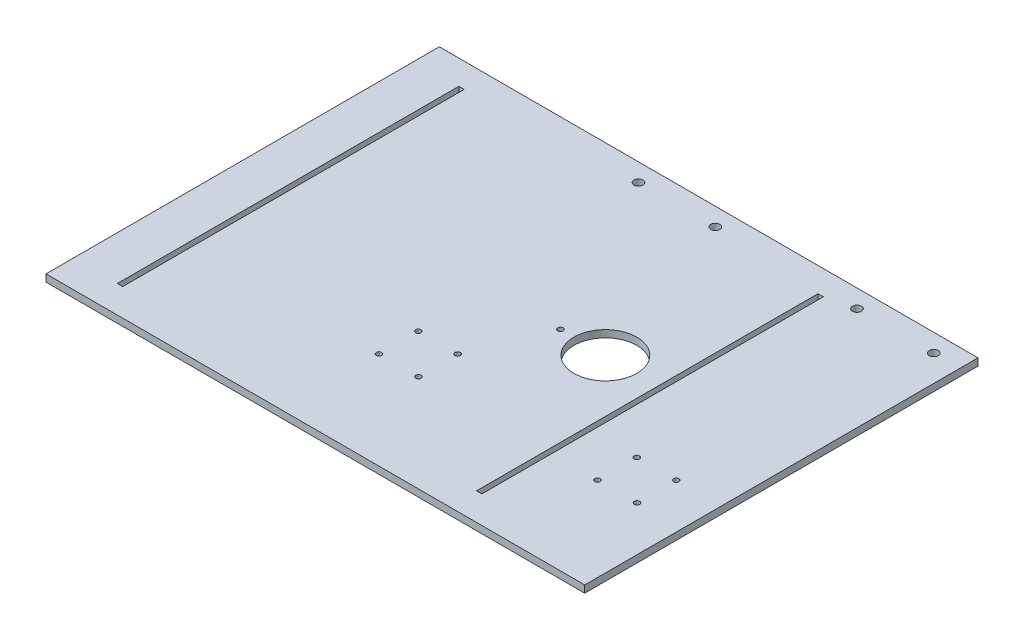
ISO-10303-21;
HEADER;
FILE_DESCRIPTION(('STEP AP214'),'2;1');
FILE_NAME('part.step','',(''),(''),'','','');
FILE_SCHEMA(('AUTOMOTIVE_DESIGN { 1 0 10303 214 1 1 1 1 }'));
ENDSEC;
DATA;
#1=APPLICATION_CONTEXT('core data for automotive mechanical design processes');
#2=APPLICATION_PROTOCOL_DEFINITION('international standard','automotive_design',2000,#1);
#3=PRODUCT_CONTEXT('',#1,'mechanical');
#4=PRODUCT('Part','Part','',(#3));
#5=PRODUCT_RELATED_PRODUCT_CATEGORY('part','',(#4));
#6=PRODUCT_DEFINITION_FORMATION('','',#4);
#7=PRODUCT_DEFINITION_CONTEXT('part definition',#1,'design');
#8=PRODUCT_DEFINITION('design','',#6,#7);
#9=PRODUCT_DEFINITION_SHAPE('','',#8);
#10=(LENGTH_UNIT() NAMED_UNIT(*) SI_UNIT(.MILLI.,.METRE.));
#11=(NAMED_UNIT(*) PLANE_ANGLE_UNIT() SI_UNIT($,.RADIAN.));
#12=(NAMED_UNIT(*) SI_UNIT($,.STERADIAN.) SOLID_ANGLE_UNIT());
#13=UNCERTAINTY_MEASURE_WITH_UNIT(LENGTH_MEASURE(1.E-05),#10,'distance_accuracy_value','');
#14=(GEOMETRIC_REPRESENTATION_CONTEXT(3) GLOBAL_UNCERTAINTY_ASSIGNED_CONTEXT((#13)) GLOBAL_UNIT_ASSIGNED_CONTEXT((#10,
#11,#12)) REPRESENTATION_CONTEXT('',''));
#15=CARTESIAN_POINT('',(0.,0.,0.));
#16=DIRECTION('',(0.,0.,1.));
#17=DIRECTION('',(1.,0.,0.));
#18=AXIS2_PLACEMENT_3D('',#15,#16,#17);
#19=CARTESIAN_POINT('',(0.,4.,0.));
#20=DIRECTION('',(0.,-1.,0.));
#21=DIRECTION('',(0.,0.,-1.));
#22=AXIS2_PLACEMENT_3D('',#19,#20,#21);
#23=PLANE('',#22);
#24=CARTESIAN_POINT('',(20.,4.,-7.00000000000002));
#25=DIRECTION('',(0.,-1.,0.));
#26=DIRECTION('',(0.,0.,-1.));
#27=AXIS2_PLACEMENT_3D('',#24,#25,#26);
#28=CIRCLE('',#27,1.5);
#29=CARTESIAN_POINT('',(20.,4.,-8.50000000000002));
#30=VERTEX_POINT('',#29);
#31=EDGE_CURVE('E269',#30,#30,#28,.T.);
#32=ORIENTED_EDGE('',*,*,#31,.T.);
#33=EDGE_LOOP('',(#32));
#34=FACE_BOUND('',#33,.T.);
#35=CARTESIAN_POINT('',(13.71,4.,-99.5));
#36=DIRECTION('',(0.,-1.,0.));
#37=DIRECTION('',(0.,0.,-1.));
#38=AXIS2_PLACEMENT_3D('',#35,#36,#37);
#39=CIRCLE('',#38,2.5);
#40=CARTESIAN_POINT('',(13.71,4.,-102.));
#41=VERTEX_POINT('',#40);
#42=EDGE_CURVE('E258',#41,#41,#39,.T.);
#43=ORIENTED_EDGE('',*,*,#42,.T.);
#44=EDGE_LOOP('',(#43));
#45=FACE_BOUND('',#44,.T.);
#46=CARTESIAN_POINT('',(-29.07,4.,-99.5));
#47=DIRECTION('',(0.,-1.,0.));
#48=DIRECTION('',(0.,0.,-1.));
#49=AXIS2_PLACEMENT_3D('',#46,#47,#48);
#50=CIRCLE('',#49,2.5);
#51=CARTESIAN_POINT('',(-29.07,4.,-102.));
#52=VERTEX_POINT('',#51);
#53=EDGE_CURVE('E264',#52,#52,#50,.T.);
#54=ORIENTED_EDGE('',*,*,#53,.T.);
#55=EDGE_LOOP('',(#54));
#56=FACE_BOUND('',#55,.T.);
#57=CARTESIAN_POINT('',(135.39,4.,-99.5));
#58=DIRECTION('',(0.,-1.,0.));
#59=DIRECTION('',(0.,0.,-1.));
#60=AXIS2_PLACEMENT_3D('',#57,#58,#59);
#61=CIRCLE('',#60,2.5);
#62=CARTESIAN_POINT('',(135.39,4.,-102.));
#63=VERTEX_POINT('',#62);
#64=EDGE_CURVE('E253',#63,#63,#61,.T.);
#65=ORIENTED_EDGE('',*,*,#64,.T.);
#66=EDGE_LOOP('',(#65));
#67=FACE_BOUND('',#66,.T.);
#68=CARTESIAN_POINT('',(92.61,4.,-99.5));
#69=DIRECTION('',(0.,-1.,0.));
#70=DIRECTION('',(0.,0.,-1.));
#71=AXIS2_PLACEMENT_3D('',#68,#69,#70);
#72=CIRCLE('',#71,2.50000000000001);
#73=CARTESIAN_POINT('',(92.61,4.,-102.));
#74=VERTEX_POINT('',#73);
#75=EDGE_CURVE('E262',#74,#74,#72,.T.);
#76=ORIENTED_EDGE('',*,*,#75,.T.);
#77=EDGE_LOOP('',(#76));
#78=FACE_BOUND('',#77,.T.);
#79=CARTESIAN_POINT('',(-18.68,4.,55.39));
#80=DIRECTION('',(0.,-1.,0.));
#81=DIRECTION('',(0.,0.,-1.));
#82=AXIS2_PLACEMENT_3D('',#79,#80,#81);
#83=CIRCLE('',#82,1.5);
#84=CARTESIAN_POINT('',(-18.68,4.,53.89));
#85=VERTEX_POINT('',#84);
#86=EDGE_CURVE('E255',#85,#85,#83,.T.);
#87=ORIENTED_EDGE('',*,*,#86,.T.);
#88=EDGE_LOOP('',(#87));
#89=FACE_BOUND('',#88,.T.);
#90=CARTESIAN_POINT('',(-18.68,4.,33.54));
#91=DIRECTION('',(0.,-1.,0.));
#92=DIRECTION('',(0.,0.,-1.));
#93=AXIS2_PLACEMENT_3D('',#90,#91,#92);
#94=CIRCLE('',#93,1.5);
#95=CARTESIAN_POINT('',(-18.68,4.,32.04));
#96=VERTEX_POINT('',#95);
#97=EDGE_CURVE('E281',#96,#96,#94,.T.);
#98=ORIENTED_EDGE('',*,*,#97,.T.);
#99=EDGE_LOOP('',(#98));
#100=FACE_BOUND('',#99,.T.);
#101=CARTESIAN_POINT('',(3.31999999999999,4.,33.54));
#102=DIRECTION('',(0.,-1.,0.));
#103=DIRECTION('',(0.,0.,-1.));
#104=AXIS2_PLACEMENT_3D('',#101,#102,#103);
#105=CIRCLE('',#104,1.5);
#106=CARTESIAN_POINT('',(3.31999999999999,4.,32.04));
#107=VERTEX_POINT('',#106);
#108=EDGE_CURVE('E278',#107,#107,#105,.T.);
#109=ORIENTED_EDGE('',*,*,#108,.T.);
#110=EDGE_LOOP('',(#109));
#111=FACE_BOUND('',#110,.T.);
#112=CARTESIAN_POINT('',(3.31999999999999,4.,55.39));
#113=DIRECTION('',(0.,-1.,0.));
#114=DIRECTION('',(0.,0.,-1.));
#115=AXIS2_PLACEMENT_3D('',#112,#113,#114);
#116=CIRCLE('',#115,1.5);
#117=CARTESIAN_POINT('',(3.31999999999999,4.,53.89));
#118=VERTEX_POINT('',#117);
#119=EDGE_CURVE('E239',#118,#118,#116,.T.);
#120=ORIENTED_EDGE('',*,*,#119,.T.);
#121=EDGE_LOOP('',(#120));
#122=FACE_BOUND('',#121,.T.);
#123=CARTESIAN_POINT('',(103.,4.,55.39));
#124=DIRECTION('',(0.,-1.,0.));
#125=DIRECTION('',(0.,0.,-1.));
#126=AXIS2_PLACEMENT_3D('',#123,#124,#125);
#127=CIRCLE('',#126,1.5);
#128=CARTESIAN_POINT('',(103.,4.,53.89));
#129=VERTEX_POINT('',#128);
#130=EDGE_CURVE('E248',#129,#129,#127,.T.);
#131=ORIENTED_EDGE('',*,*,#130,.T.);
#132=EDGE_LOOP('',(#131));
#133=FACE_BOUND('',#132,.T.);
#134=CARTESIAN_POINT('',(103.,4.,33.54));
#135=DIRECTION('',(0.,-1.,0.));
#136=DIRECTION('',(0.,0.,-1.));
#137=AXIS2_PLACEMENT_3D('',#134,#135,#136);
#138=CIRCLE('',#137,1.5);
#139=CARTESIAN_POINT('',(103.,4.,32.04));
#140=VERTEX_POINT('',#139);
#141=EDGE_CURVE('E291',#140,#140,#138,.T.);
#142=ORIENTED_EDGE('',*,*,#141,.T.);
#143=EDGE_LOOP('',(#142));
#144=FACE_BOUND('',#143,.T.);
#145=CARTESIAN_POINT('',(125.,4.,33.54));
#146=DIRECTION('',(0.,-1.,0.));
#147=DIRECTION('',(0.,0.,-1.));
#148=AXIS2_PLACEMENT_3D('',#145,#146,#147);
#149=CIRCLE('',#148,1.5);
#150=CARTESIAN_POINT('',(125.,4.,32.04));
#151=VERTEX_POINT('',#150);
#152=EDGE_CURVE('E288',#151,#151,#149,.T.);
#153=ORIENTED_EDGE('',*,*,#152,.T.);
#154=EDGE_LOOP('',(#153));
#155=FACE_BOUND('',#154,.T.);
#156=CARTESIAN_POINT('',(125.,4.,55.39));
#157=DIRECTION('',(0.,-1.,0.));
#158=DIRECTION('',(0.,0.,-1.));
#159=AXIS2_PLACEMENT_3D('',#156,#157,#158);
#160=CIRCLE('',#159,1.5);
#161=CARTESIAN_POINT('',(125.,4.,53.89));
#162=VERTEX_POINT('',#161);
#163=EDGE_CURVE('E225',#162,#162,#160,.T.);
#164=ORIENTED_EDGE('',*,*,#163,.T.);
#165=EDGE_LOOP('',(#164));
#166=FACE_BOUND('',#165,.T.);
#167=CARTESIAN_POINT('',(45.,4.,-7.00000000000002));
#168=DIRECTION('',(0.,-1.,0.));
#169=DIRECTION('',(0.,0.,-1.));
#170=AXIS2_PLACEMENT_3D('',#167,#168,#169);
#171=CIRCLE('',#170,17.5);
#172=CARTESIAN_POINT('',(45.,4.,-24.5));
#173=VERTEX_POINT('',#172);
#174=EDGE_CURVE('E155',#173,#173,#171,.T.);
#175=ORIENTED_EDGE('',*,*,#174,.T.);
#176=EDGE_LOOP('',(#175));
#177=FACE_BOUND('',#176,.T.);
#178=DIRECTION('',(-1.,0.,0.));
#179=VECTOR('',#178,1.);
#180=CARTESIAN_POINT('',(-122.5,4.,-95.8859395802149));
#181=LINE('',#180,#179);
#182=CARTESIAN_POINT('',(-122.5,4.,-95.8859395802149));
#183=VERTEX_POINT('',#182);
#184=CARTESIAN_POINT('',(-125.5,4.,-95.8859395802149));
#185=VERTEX_POINT('',#184);
#186=EDGE_CURVE('E165',#183,#185,#181,.T.);
#187=ORIENTED_EDGE('',*,*,#186,.F.);
#188=DIRECTION('',(0.,0.,-1.));
#189=VECTOR('',#188,1.);
#190=CARTESIAN_POINT('',(-122.5,4.,94.2851089201768));
#191=LINE('',#190,#189);
#192=CARTESIAN_POINT('',(-122.5,4.,94.2851089201768));
#193=VERTEX_POINT('',#192);
#194=EDGE_CURVE('E173',#193,#183,#191,.T.);
#195=ORIENTED_EDGE('',*,*,#194,.F.);
#196=DIRECTION('',(1.,0.,0.));
#197=VECTOR('',#196,1.);
#198=CARTESIAN_POINT('',(-125.5,4.,94.2851089201768));
#199=LINE('',#198,#197);
#200=CARTESIAN_POINT('',(-125.5,4.,94.2851089201768));
#201=VERTEX_POINT('',#200);
#202=EDGE_CURVE('E170',#201,#193,#199,.T.);
#203=ORIENTED_EDGE('',*,*,#202,.F.);
#204=DIRECTION('',(0.,0.,1.));
#205=VECTOR('',#204,1.);
#206=CARTESIAN_POINT('',(-125.5,4.,-95.8859395802149));
#207=LINE('',#206,#205);
#208=EDGE_CURVE('E167',#185,#201,#207,.T.);
#209=ORIENTED_EDGE('',*,*,#208,.F.);
#210=EDGE_LOOP('',(#187,#195,#203,#209));
#211=FACE_BOUND('',#210,.T.);
#212=DIRECTION('',(0.,0.,-1.));
#213=VECTOR('',#212,1.);
#214=CARTESIAN_POINT('',(150.,4.,109.5));
#215=LINE('',#214,#213);
#216=CARTESIAN_POINT('',(150.,4.,109.5));
#217=VERTEX_POINT('',#216);
#218=CARTESIAN_POINT('',(150.,4.,-109.5));
#219=VERTEX_POINT('',#218);
#220=EDGE_CURVE('E196',#217,#219,#215,.T.);
#221=ORIENTED_EDGE('',*,*,#220,.T.);
#222=DIRECTION('',(-1.,0.,0.));
#223=VECTOR('',#222,1.);
#224=CARTESIAN_POINT('',(-150.,4.,-109.5));
#225=LINE('',#224,#223);
#226=CARTESIAN_POINT('',(-150.,4.,-109.5));
#227=VERTEX_POINT('',#226);
#228=EDGE_CURVE('E199',#219,#227,#225,.T.);
#229=ORIENTED_EDGE('',*,*,#228,.T.);
#230=DIRECTION('',(0.,0.,1.));
#231=VECTOR('',#230,1.);
#232=CARTESIAN_POINT('',(-150.,4.,109.5));
#233=LINE('',#232,#231);
#234=CARTESIAN_POINT('',(-150.,4.,109.5));
#235=VERTEX_POINT('',#234);
#236=EDGE_CURVE('E202',#227,#235,#233,.T.);
#237=ORIENTED_EDGE('',*,*,#236,.T.);
#238=DIRECTION('',(1.,0.,0.));
#239=VECTOR('',#238,1.);
#240=CARTESIAN_POINT('',(-150.,4.,109.5));
#241=LINE('',#240,#239);
#242=EDGE_CURVE('E204',#235,#217,#241,.T.);
#243=ORIENTED_EDGE('',*,*,#242,.T.);
#244=EDGE_LOOP('',(#221,#229,#237,#243));
#245=FACE_BOUND('',#244,.T.);
#246=DIRECTION('',(1.,0.,0.));
#247=VECTOR('',#246,1.);
#248=CARTESIAN_POINT('',(74.5,4.,94.2851089201768));
#249=LINE('',#248,#247);
#250=CARTESIAN_POINT('',(74.5,4.,94.2851089201768));
#251=VERTEX_POINT('',#250);
#252=CARTESIAN_POINT('',(77.5,4.,94.2851089201768));
#253=VERTEX_POINT('',#252);
#254=EDGE_CURVE('E127',#251,#253,#249,.T.);
#255=ORIENTED_EDGE('',*,*,#254,.F.);
#256=DIRECTION('',(0.,0.,1.));
#257=VECTOR('',#256,1.);
#258=CARTESIAN_POINT('',(74.5,4.,-95.8859395802149));
#259=LINE('',#258,#257);
#260=CARTESIAN_POINT('',(74.5,4.,-95.8859395802149));
#261=VERTEX_POINT('',#260);
#262=EDGE_CURVE('E149',#261,#251,#259,.T.);
#263=ORIENTED_EDGE('',*,*,#262,.F.);
#264=DIRECTION('',(-1.,0.,0.));
#265=VECTOR('',#264,1.);
#266=CARTESIAN_POINT('',(77.5,4.,-95.8859395802149));
#267=LINE('',#266,#265);
#268=CARTESIAN_POINT('',(77.5,4.,-95.8859395802149));
#269=VERTEX_POINT('',#268);
#270=EDGE_CURVE('E147',#269,#261,#267,.T.);
#271=ORIENTED_EDGE('',*,*,#270,.F.);
#272=DIRECTION('',(0.,0.,-1.));
#273=VECTOR('',#272,1.);
#274=CARTESIAN_POINT('',(77.5,4.,94.2851089201768));
#275=LINE('',#274,#273);
#276=EDGE_CURVE('E135',#253,#269,#275,.T.);
#277=ORIENTED_EDGE('',*,*,#276,.F.);
#278=EDGE_LOOP('',(#255,#263,#271,#277));
#279=FACE_BOUND('',#278,.T.);
#280=ADVANCED_FACE('F36',(#34,#45,#56,#67,#78,#89,#100,#111,#122,#133,#144,#155,#166,#177,#211,
#245,#279),#23,.F.);
#281=CARTESIAN_POINT('',(0.,0.,0.));
#282=DIRECTION('',(0.,-1.,0.));
#283=DIRECTION('',(0.,0.,-1.));
#284=AXIS2_PLACEMENT_3D('',#281,#282,#283);
#285=PLANE('',#284);
#286=CARTESIAN_POINT('',(20.,0.,-7.00000000000002));
#287=DIRECTION('',(0.,1.,0.));
#288=DIRECTION('',(0.,0.,1.));
#289=AXIS2_PLACEMENT_3D('',#286,#287,#288);
#290=CIRCLE('',#289,1.5);
#291=CARTESIAN_POINT('',(20.,0.,-5.50000000000002));
#292=VERTEX_POINT('',#291);
#293=EDGE_CURVE('E659',#292,#292,#290,.T.);
#294=ORIENTED_EDGE('',*,*,#293,.T.);
#295=EDGE_LOOP('',(#294));
#296=FACE_BOUND('',#295,.T.);
#297=CARTESIAN_POINT('',(13.71,0.,-99.5));
#298=DIRECTION('',(0.,-1.,0.));
#299=DIRECTION('',(0.,0.,-1.));
#300=AXIS2_PLACEMENT_3D('',#297,#298,#299);
#301=CIRCLE('',#300,2.5);
#302=CARTESIAN_POINT('',(13.71,0.,-102.));
#303=VERTEX_POINT('',#302);
#304=EDGE_CURVE('E40',#303,#303,#301,.T.);
#305=ORIENTED_EDGE('',*,*,#304,.F.);
#306=EDGE_LOOP('',(#305));
#307=FACE_BOUND('',#306,.T.);
#308=CARTESIAN_POINT('',(-29.07,0.,-99.5));
#309=DIRECTION('',(0.,-1.,0.));
#310=DIRECTION('',(0.,0.,-1.));
#311=AXIS2_PLACEMENT_3D('',#308,#309,#310);
#312=CIRCLE('',#311,2.5);
#313=CARTESIAN_POINT('',(-29.07,0.,-102.));
#314=VERTEX_POINT('',#313);
#315=EDGE_CURVE('E256',#314,#314,#312,.T.);
#316=ORIENTED_EDGE('',*,*,#315,.F.);
#317=EDGE_LOOP('',(#316));
#318=FACE_BOUND('',#317,.T.);
#319=CARTESIAN_POINT('',(135.39,0.,-99.5));
#320=DIRECTION('',(0.,-1.,0.));
#321=DIRECTION('',(0.,0.,-1.));
#322=AXIS2_PLACEMENT_3D('',#319,#320,#321);
#323=CIRCLE('',#322,2.5);
#324=CARTESIAN_POINT('',(135.39,0.,-102.));
#325=VERTEX_POINT('',#324);
#326=EDGE_CURVE('E252',#325,#325,#323,.T.);
#327=ORIENTED_EDGE('',*,*,#326,.F.);
#328=EDGE_LOOP('',(#327));
#329=FACE_BOUND('',#328,.T.);
#330=CARTESIAN_POINT('',(92.61,0.,-99.5));
#331=DIRECTION('',(0.,-1.,0.));
#332=DIRECTION('',(0.,0.,-1.));
#333=AXIS2_PLACEMENT_3D('',#330,#331,#332);
#334=CIRCLE('',#333,2.50000000000001);
#335=CARTESIAN_POINT('',(92.61,0.,-102.));
#336=VERTEX_POINT('',#335);
#337=EDGE_CURVE('E249',#336,#336,#334,.T.);
#338=ORIENTED_EDGE('',*,*,#337,.F.);
#339=EDGE_LOOP('',(#338));
#340=FACE_BOUND('',#339,.T.);
#341=CARTESIAN_POINT('',(-18.68,0.,55.39));
#342=DIRECTION('',(0.,-1.,0.));
#343=DIRECTION('',(0.,0.,-1.));
#344=AXIS2_PLACEMENT_3D('',#341,#342,#343);
#345=CIRCLE('',#344,1.5);
#346=CARTESIAN_POINT('',(-18.68,0.,53.89));
#347=VERTEX_POINT('',#346);
#348=EDGE_CURVE('E245',#347,#347,#345,.T.);
#349=ORIENTED_EDGE('',*,*,#348,.F.);
#350=EDGE_LOOP('',(#349));
#351=FACE_BOUND('',#350,.T.);
#352=CARTESIAN_POINT('',(-18.68,0.,33.54));
#353=DIRECTION('',(0.,-1.,0.));
#354=DIRECTION('',(0.,0.,-1.));
#355=AXIS2_PLACEMENT_3D('',#352,#353,#354);
#356=CIRCLE('',#355,1.5);
#357=CARTESIAN_POINT('',(-18.68,0.,32.04));
#358=VERTEX_POINT('',#357);
#359=EDGE_CURVE('E242',#358,#358,#356,.T.);
#360=ORIENTED_EDGE('',*,*,#359,.F.);
#361=EDGE_LOOP('',(#360));
#362=FACE_BOUND('',#361,.T.);
#363=CARTESIAN_POINT('',(3.31999999999999,0.,33.54));
#364=DIRECTION('',(0.,-1.,0.));
#365=DIRECTION('',(0.,0.,-1.));
#366=AXIS2_PLACEMENT_3D('',#363,#364,#365);
#367=CIRCLE('',#366,1.5);
#368=CARTESIAN_POINT('',(3.31999999999999,0.,32.04));
#369=VERTEX_POINT('',#368);
#370=EDGE_CURVE('E238',#369,#369,#367,.T.);
#371=ORIENTED_EDGE('',*,*,#370,.F.);
#372=EDGE_LOOP('',(#371));
#373=FACE_BOUND('',#372,.T.);
#374=CARTESIAN_POINT('',(3.31999999999999,0.,55.39));
#375=DIRECTION('',(0.,-1.,0.));
#376=DIRECTION('',(0.,0.,-1.));
#377=AXIS2_PLACEMENT_3D('',#374,#375,#376);
#378=CIRCLE('',#377,1.5);
#379=CARTESIAN_POINT('',(3.31999999999999,0.,53.89));
#380=VERTEX_POINT('',#379);
#381=EDGE_CURVE('E235',#380,#380,#378,.T.);
#382=ORIENTED_EDGE('',*,*,#381,.F.);
#383=EDGE_LOOP('',(#382));
#384=FACE_BOUND('',#383,.T.);
#385=CARTESIAN_POINT('',(103.,0.,55.39));
#386=DIRECTION('',(0.,-1.,0.));
#387=DIRECTION('',(0.,0.,-1.));
#388=AXIS2_PLACEMENT_3D('',#385,#386,#387);
#389=CIRCLE('',#388,1.5);
#390=CARTESIAN_POINT('',(103.,0.,53.89));
#391=VERTEX_POINT('',#390);
#392=EDGE_CURVE('E231',#391,#391,#389,.T.);
#393=ORIENTED_EDGE('',*,*,#392,.F.);
#394=EDGE_LOOP('',(#393));
#395=FACE_BOUND('',#394,.T.);
#396=CARTESIAN_POINT('',(103.,0.,33.54));
#397=DIRECTION('',(0.,-1.,0.));
#398=DIRECTION('',(0.,0.,-1.));
#399=AXIS2_PLACEMENT_3D('',#396,#397,#398);
#400=CIRCLE('',#399,1.5);
#401=CARTESIAN_POINT('',(103.,0.,32.04));
#402=VERTEX_POINT('',#401);
#403=EDGE_CURVE('E228',#402,#402,#400,.T.);
#404=ORIENTED_EDGE('',*,*,#403,.F.);
#405=EDGE_LOOP('',(#404));
#406=FACE_BOUND('',#405,.T.);
#407=CARTESIAN_POINT('',(125.,0.,33.54));
#408=DIRECTION('',(0.,-1.,0.));
#409=DIRECTION('',(0.,0.,-1.));
#410=AXIS2_PLACEMENT_3D('',#407,#408,#409);
#411=CIRCLE('',#410,1.5);
#412=CARTESIAN_POINT('',(125.,0.,32.04));
#413=VERTEX_POINT('',#412);
#414=EDGE_CURVE('E224',#413,#413,#411,.T.);
#415=ORIENTED_EDGE('',*,*,#414,.F.);
#416=EDGE_LOOP('',(#415));
#417=FACE_BOUND('',#416,.T.);
#418=CARTESIAN_POINT('',(125.,0.,55.39));
#419=DIRECTION('',(0.,-1.,0.));
#420=DIRECTION('',(0.,0.,-1.));
#421=AXIS2_PLACEMENT_3D('',#418,#419,#420);
#422=CIRCLE('',#421,1.5);
#423=CARTESIAN_POINT('',(125.,0.,53.89));
#424=VERTEX_POINT('',#423);
#425=EDGE_CURVE('E221',#424,#424,#422,.T.);
#426=ORIENTED_EDGE('',*,*,#425,.F.);
#427=EDGE_LOOP('',(#426));
#428=FACE_BOUND('',#427,.T.);
#429=CARTESIAN_POINT('',(45.,0.,-7.00000000000002));
#430=DIRECTION('',(0.,-1.,0.));
#431=DIRECTION('',(0.,0.,-1.));
#432=AXIS2_PLACEMENT_3D('',#429,#430,#431);
#433=CIRCLE('',#432,17.5);
#434=CARTESIAN_POINT('',(45.,0.,-24.5));
#435=VERTEX_POINT('',#434);
#436=EDGE_CURVE('E234',#435,#435,#433,.T.);
#437=ORIENTED_EDGE('',*,*,#436,.F.);
#438=EDGE_LOOP('',(#437));
#439=FACE_BOUND('',#438,.T.);
#440=DIRECTION('',(0.,0.,-1.));
#441=VECTOR('',#440,1.);
#442=CARTESIAN_POINT('',(150.,0.,109.5));
#443=LINE('',#442,#441);
#444=CARTESIAN_POINT('',(150.,0.,109.5));
#445=VERTEX_POINT('',#444);
#446=CARTESIAN_POINT('',(150.,0.,-109.5));
#447=VERTEX_POINT('',#446);
#448=EDGE_CURVE('E195',#445,#447,#443,.T.);
#449=ORIENTED_EDGE('',*,*,#448,.F.);
#450=DIRECTION('',(1.,0.,0.));
#451=VECTOR('',#450,1.);
#452=CARTESIAN_POINT('',(-150.,0.,109.5));
#453=LINE('',#452,#451);
#454=CARTESIAN_POINT('',(-150.,0.,109.5));
#455=VERTEX_POINT('',#454);
#456=EDGE_CURVE('E200',#455,#445,#453,.T.);
#457=ORIENTED_EDGE('',*,*,#456,.F.);
#458=DIRECTION('',(0.,0.,1.));
#459=VECTOR('',#458,1.);
#460=CARTESIAN_POINT('',(-150.,0.,109.5));
#461=LINE('',#460,#459);
#462=CARTESIAN_POINT('',(-150.,0.,-109.5));
#463=VERTEX_POINT('',#462);
#464=EDGE_CURVE('E211',#463,#455,#461,.T.);
#465=ORIENTED_EDGE('',*,*,#464,.F.);
#466=DIRECTION('',(-1.,0.,0.));
#467=VECTOR('',#466,1.);
#468=CARTESIAN_POINT('',(-150.,0.,-109.5));
#469=LINE('',#468,#467);
#470=EDGE_CURVE('E209',#447,#463,#469,.T.);
#471=ORIENTED_EDGE('',*,*,#470,.F.);
#472=EDGE_LOOP('',(#449,#457,#465,#471));
#473=FACE_BOUND('',#472,.T.);
#474=DIRECTION('',(0.,0.,-1.));
#475=VECTOR('',#474,1.);
#476=CARTESIAN_POINT('',(-122.5,0.,94.2851089201768));
#477=LINE('',#476,#475);
#478=CARTESIAN_POINT('',(-122.5,0.,94.2851089201768));
#479=VERTEX_POINT('',#478);
#480=CARTESIAN_POINT('',(-122.5,0.,-95.8859395802149));
#481=VERTEX_POINT('',#480);
#482=EDGE_CURVE('E168',#479,#481,#477,.T.);
#483=ORIENTED_EDGE('',*,*,#482,.T.);
#484=DIRECTION('',(-1.,0.,0.));
#485=VECTOR('',#484,1.);
#486=CARTESIAN_POINT('',(-122.5,0.,-95.8859395802149));
#487=LINE('',#486,#485);
#488=CARTESIAN_POINT('',(-125.5,0.,-95.8859395802149));
#489=VERTEX_POINT('',#488);
#490=EDGE_CURVE('E143',#481,#489,#487,.T.);
#491=ORIENTED_EDGE('',*,*,#490,.T.);
#492=DIRECTION('',(0.,0.,1.));
#493=VECTOR('',#492,1.);
#494=CARTESIAN_POINT('',(-125.5,0.,-95.8859395802149));
#495=LINE('',#494,#493);
#496=CARTESIAN_POINT('',(-125.5,0.,94.2851089201768));
#497=VERTEX_POINT('',#496);
#498=EDGE_CURVE('E178',#489,#497,#495,.T.);
#499=ORIENTED_EDGE('',*,*,#498,.T.);
#500=DIRECTION('',(1.,0.,0.));
#501=VECTOR('',#500,1.);
#502=CARTESIAN_POINT('',(-125.5,0.,94.2851089201768));
#503=LINE('',#502,#501);
#504=EDGE_CURVE('E181',#497,#479,#503,.T.);
#505=ORIENTED_EDGE('',*,*,#504,.T.);
#506=EDGE_LOOP('',(#483,#491,#499,#505));
#507=FACE_BOUND('',#506,.T.);
#508=DIRECTION('',(0.,0.,1.));
#509=VECTOR('',#508,1.);
#510=CARTESIAN_POINT('',(74.5,0.,-95.8859395802149));
#511=LINE('',#510,#509);
#512=CARTESIAN_POINT('',(74.5,0.,-95.8859395802149));
#513=VERTEX_POINT('',#512);
#514=CARTESIAN_POINT('',(74.5,0.,94.2851089201768));
#515=VERTEX_POINT('',#514);
#516=EDGE_CURVE('E136',#513,#515,#511,.T.);
#517=ORIENTED_EDGE('',*,*,#516,.T.);
#518=DIRECTION('',(1.,0.,0.));
#519=VECTOR('',#518,1.);
#520=CARTESIAN_POINT('',(74.5,0.,94.2851089201768));
#521=LINE('',#520,#519);
#522=CARTESIAN_POINT('',(77.5,0.,94.2851089201768));
#523=VERTEX_POINT('',#522);
#524=EDGE_CURVE('E61',#515,#523,#521,.T.);
#525=ORIENTED_EDGE('',*,*,#524,.T.);
#526=DIRECTION('',(0.,0.,-1.));
#527=VECTOR('',#526,1.);
#528=CARTESIAN_POINT('',(77.5,0.,94.2851089201768));
#529=LINE('',#528,#527);
#530=CARTESIAN_POINT('',(77.5,0.,-95.8859395802149));
#531=VERTEX_POINT('',#530);
#532=EDGE_CURVE('E142',#523,#531,#529,.T.);
#533=ORIENTED_EDGE('',*,*,#532,.T.);
#534=DIRECTION('',(-1.,0.,0.));
#535=VECTOR('',#534,1.);
#536=CARTESIAN_POINT('',(77.5,0.,-95.8859395802149));
#537=LINE('',#536,#535);
#538=EDGE_CURVE('E157',#531,#513,#537,.T.);
#539=ORIENTED_EDGE('',*,*,#538,.T.);
#540=EDGE_LOOP('',(#517,#525,#533,#539));
#541=FACE_BOUND('',#540,.T.);
#542=ADVANCED_FACE('F304',(#296,#307,#318,#329,#340,#351,#362,#373,#384,#395,#406,#417,#428,
#439,#473,#507,#541),#285,.T.);
#543=CARTESIAN_POINT('',(150.,4.,109.5));
#544=DIRECTION('',(-1.,0.,0.));
#545=DIRECTION('',(0.,0.,1.));
#546=AXIS2_PLACEMENT_3D('',#543,#544,#545);
#547=PLANE('',#546);
#548=ORIENTED_EDGE('',*,*,#448,.T.);
#549=DIRECTION('',(0.,-1.,0.));
#550=VECTOR('',#549,1.);
#551=CARTESIAN_POINT('',(150.,4.,-109.5));
#552=LINE('',#551,#550);
#553=EDGE_CURVE('E11',#219,#447,#552,.T.);
#554=ORIENTED_EDGE('',*,*,#553,.F.);
#555=ORIENTED_EDGE('',*,*,#220,.F.);
#556=DIRECTION('',(0.,-1.,0.));
#557=VECTOR('',#556,1.);
#558=CARTESIAN_POINT('',(150.,4.,109.5));
#559=LINE('',#558,#557);
#560=EDGE_CURVE('E206',#217,#445,#559,.T.);
#561=ORIENTED_EDGE('',*,*,#560,.T.);
#562=EDGE_LOOP('',(#548,#554,#555,#561));
#563=FACE_BOUND('',#562,.T.);
#564=ADVANCED_FACE('F38',(#563),#547,.F.);
#565=CARTESIAN_POINT('',(-150.,4.,-109.5));
#566=DIRECTION('',(0.,0.,1.));
#567=DIRECTION('',(1.,0.,0.));
#568=AXIS2_PLACEMENT_3D('',#565,#566,#567);
#569=PLANE('',#568);
#570=ORIENTED_EDGE('',*,*,#470,.T.);
#571=DIRECTION('',(0.,-1.,0.));
#572=VECTOR('',#571,1.);
#573=CARTESIAN_POINT('',(-150.,4.,-109.5));
#574=LINE('',#573,#572);
#575=EDGE_CURVE('E45',#227,#463,#574,.T.);
#576=ORIENTED_EDGE('',*,*,#575,.F.);
#577=ORIENTED_EDGE('',*,*,#228,.F.);
#578=ORIENTED_EDGE('',*,*,#553,.T.);
#579=EDGE_LOOP('',(#570,#576,#577,#578));
#580=FACE_BOUND('',#579,.T.);
#581=ADVANCED_FACE('F344',(#580),#569,.F.);
#582=CARTESIAN_POINT('',(-150.,4.,109.5));
#583=DIRECTION('',(1.,0.,0.));
#584=DIRECTION('',(0.,0.,-1.));
#585=AXIS2_PLACEMENT_3D('',#582,#583,#584);
#586=PLANE('',#585);
#587=ORIENTED_EDGE('',*,*,#464,.T.);
#588=DIRECTION('',(0.,-1.,0.));
#589=VECTOR('',#588,1.);
#590=CARTESIAN_POINT('',(-150.,4.,109.5));
#591=LINE('',#590,#589);
#592=EDGE_CURVE('E216',#235,#455,#591,.T.);
#593=ORIENTED_EDGE('',*,*,#592,.F.);
#594=ORIENTED_EDGE('',*,*,#236,.F.);
#595=ORIENTED_EDGE('',*,*,#575,.T.);
#596=EDGE_LOOP('',(#587,#593,#594,#595));
#597=FACE_BOUND('',#596,.T.);
#598=ADVANCED_FACE('F341',(#597),#586,.F.);
#599=CARTESIAN_POINT('',(-150.,4.,109.5));
#600=DIRECTION('',(0.,0.,-1.));
#601=DIRECTION('',(-1.,0.,0.));
#602=AXIS2_PLACEMENT_3D('',#599,#600,#601);
#603=PLANE('',#602);
#604=ORIENTED_EDGE('',*,*,#456,.T.);
#605=ORIENTED_EDGE('',*,*,#560,.F.);
#606=ORIENTED_EDGE('',*,*,#242,.F.);
#607=ORIENTED_EDGE('',*,*,#592,.T.);
#608=EDGE_LOOP('',(#604,#605,#606,#607));
#609=FACE_BOUND('',#608,.T.);
#610=ADVANCED_FACE('F338',(#609),#603,.F.);
#611=CARTESIAN_POINT('',(-122.5,4.,-95.8859395802149));
#612=DIRECTION('',(0.,0.,1.));
#613=DIRECTION('',(1.,0.,0.));
#614=AXIS2_PLACEMENT_3D('',#611,#612,#613);
#615=PLANE('',#614);
#616=ORIENTED_EDGE('',*,*,#490,.F.);
#617=DIRECTION('',(0.,-1.,0.));
#618=VECTOR('',#617,1.);
#619=CARTESIAN_POINT('',(-122.5,4.,-95.8859395802149));
#620=LINE('',#619,#618);
#621=EDGE_CURVE('E175',#183,#481,#620,.T.);
#622=ORIENTED_EDGE('',*,*,#621,.F.);
#623=ORIENTED_EDGE('',*,*,#186,.T.);
#624=DIRECTION('',(0.,-1.,0.));
#625=VECTOR('',#624,1.);
#626=CARTESIAN_POINT('',(-125.5,4.,-95.8859395802149));
#627=LINE('',#626,#625);
#628=EDGE_CURVE('E192',#185,#489,#627,.T.);
#629=ORIENTED_EDGE('',*,*,#628,.T.);
#630=EDGE_LOOP('',(#616,#622,#623,#629));
#631=FACE_BOUND('',#630,.T.);
#632=ADVANCED_FACE('F335',(#631),#615,.T.);
#633=CARTESIAN_POINT('',(-125.5,4.,-95.8859395802149));
#634=DIRECTION('',(1.,0.,0.));
#635=DIRECTION('',(0.,0.,-1.));
#636=AXIS2_PLACEMENT_3D('',#633,#634,#635);
#637=PLANE('',#636);
#638=ORIENTED_EDGE('',*,*,#498,.F.);
#639=ORIENTED_EDGE('',*,*,#628,.F.);
#640=ORIENTED_EDGE('',*,*,#208,.T.);
#641=DIRECTION('',(0.,-1.,0.));
#642=VECTOR('',#641,1.);
#643=CARTESIAN_POINT('',(-125.5,4.,94.2851089201768));
#644=LINE('',#643,#642);
#645=EDGE_CURVE('E190',#201,#497,#644,.T.);
#646=ORIENTED_EDGE('',*,*,#645,.T.);
#647=EDGE_LOOP('',(#638,#639,#640,#646));
#648=FACE_BOUND('',#647,.T.);
#649=ADVANCED_FACE('F525',(#648),#637,.T.);
#650=CARTESIAN_POINT('',(-125.5,4.,94.2851089201768));
#651=DIRECTION('',(0.,0.,-1.));
#652=DIRECTION('',(-1.,0.,0.));
#653=AXIS2_PLACEMENT_3D('',#650,#651,#652);
#654=PLANE('',#653);
#655=ORIENTED_EDGE('',*,*,#504,.F.);
#656=ORIENTED_EDGE('',*,*,#645,.F.);
#657=ORIENTED_EDGE('',*,*,#202,.T.);
#658=DIRECTION('',(0.,-1.,0.));
#659=VECTOR('',#658,1.);
#660=CARTESIAN_POINT('',(-122.5,4.,94.2851089201768));
#661=LINE('',#660,#659);
#662=EDGE_CURVE('E188',#193,#479,#661,.T.);
#663=ORIENTED_EDGE('',*,*,#662,.T.);
#664=EDGE_LOOP('',(#655,#656,#657,#663));
#665=FACE_BOUND('',#664,.T.);
#666=ADVANCED_FACE('F515',(#665),#654,.T.);
#667=CARTESIAN_POINT('',(-122.5,4.,94.2851089201768));
#668=DIRECTION('',(-1.,0.,0.));
#669=DIRECTION('',(0.,0.,1.));
#670=AXIS2_PLACEMENT_3D('',#667,#668,#669);
#671=PLANE('',#670);
#672=ORIENTED_EDGE('',*,*,#482,.F.);
#673=ORIENTED_EDGE('',*,*,#662,.F.);
#674=ORIENTED_EDGE('',*,*,#194,.T.);
#675=ORIENTED_EDGE('',*,*,#621,.T.);
#676=EDGE_LOOP('',(#672,#673,#674,#675));
#677=FACE_BOUND('',#676,.T.);
#678=ADVANCED_FACE('F506',(#677),#671,.T.);
#679=CARTESIAN_POINT('',(74.5,4.,94.2851089201768));
#680=DIRECTION('',(0.,0.,-1.));
#681=DIRECTION('',(-1.,0.,0.));
#682=AXIS2_PLACEMENT_3D('',#679,#680,#681);
#683=PLANE('',#682);
#684=ORIENTED_EDGE('',*,*,#524,.F.);
#685=DIRECTION('',(0.,-1.,0.));
#686=VECTOR('',#685,1.);
#687=CARTESIAN_POINT('',(74.5,4.,94.2851089201768));
#688=LINE('',#687,#686);
#689=EDGE_CURVE('E131',#251,#515,#688,.T.);
#690=ORIENTED_EDGE('',*,*,#689,.F.);
#691=ORIENTED_EDGE('',*,*,#254,.T.);
#692=DIRECTION('',(0.,-1.,0.));
#693=VECTOR('',#692,1.);
#694=CARTESIAN_POINT('',(77.5,4.,94.2851089201768));
#695=LINE('',#694,#693);
#696=EDGE_CURVE('E130',#253,#523,#695,.T.);
#697=ORIENTED_EDGE('',*,*,#696,.T.);
#698=EDGE_LOOP('',(#684,#690,#691,#697));
#699=FACE_BOUND('',#698,.T.);
#700=ADVANCED_FACE('F129',(#699),#683,.T.);
#701=CARTESIAN_POINT('',(77.5,4.,94.2851089201768));
#702=DIRECTION('',(-1.,0.,0.));
#703=DIRECTION('',(0.,0.,1.));
#704=AXIS2_PLACEMENT_3D('',#701,#702,#703);
#705=PLANE('',#704);
#706=ORIENTED_EDGE('',*,*,#532,.F.);
#707=ORIENTED_EDGE('',*,*,#696,.F.);
#708=ORIENTED_EDGE('',*,*,#276,.T.);
#709=DIRECTION('',(0.,-1.,0.));
#710=VECTOR('',#709,1.);
#711=CARTESIAN_POINT('',(77.5,4.,-95.8859395802149));
#712=LINE('',#711,#710);
#713=EDGE_CURVE('E144',#269,#531,#712,.T.);
#714=ORIENTED_EDGE('',*,*,#713,.T.);
#715=EDGE_LOOP('',(#706,#707,#708,#714));
#716=FACE_BOUND('',#715,.T.);
#717=ADVANCED_FACE('F139',(#716),#705,.T.);
#718=CARTESIAN_POINT('',(77.5,4.,-95.8859395802149));
#719=DIRECTION('',(0.,0.,1.));
#720=DIRECTION('',(1.,0.,0.));
#721=AXIS2_PLACEMENT_3D('',#718,#719,#720);
#722=PLANE('',#721);
#723=ORIENTED_EDGE('',*,*,#538,.F.);
#724=ORIENTED_EDGE('',*,*,#713,.F.);
#725=ORIENTED_EDGE('',*,*,#270,.T.);
#726=DIRECTION('',(0.,-1.,0.));
#727=VECTOR('',#726,1.);
#728=CARTESIAN_POINT('',(74.5,4.,-95.8859395802149));
#729=LINE('',#728,#727);
#730=EDGE_CURVE('E53',#261,#513,#729,.T.);
#731=ORIENTED_EDGE('',*,*,#730,.T.);
#732=EDGE_LOOP('',(#723,#724,#725,#731));
#733=FACE_BOUND('',#732,.T.);
#734=ADVANCED_FACE('F317',(#733),#722,.T.);
#735=CARTESIAN_POINT('',(74.5,4.,-95.8859395802149));
#736=DIRECTION('',(1.,0.,0.));
#737=DIRECTION('',(0.,0.,-1.));
#738=AXIS2_PLACEMENT_3D('',#735,#736,#737);
#739=PLANE('',#738);
#740=ORIENTED_EDGE('',*,*,#516,.F.);
#741=ORIENTED_EDGE('',*,*,#730,.F.);
#742=ORIENTED_EDGE('',*,*,#262,.T.);
#743=ORIENTED_EDGE('',*,*,#689,.T.);
#744=EDGE_LOOP('',(#740,#741,#742,#743));
#745=FACE_BOUND('',#744,.T.);
#746=ADVANCED_FACE('F315',(#745),#739,.T.);
#747=CARTESIAN_POINT('',(45.,4.,-7.00000000000002));
#748=DIRECTION('',(0.,-1.,0.));
#749=DIRECTION('',(0.,0.,-1.));
#750=AXIS2_PLACEMENT_3D('',#747,#748,#749);
#751=CYLINDRICAL_SURFACE('',#750,17.5);
#752=ORIENTED_EDGE('',*,*,#174,.F.);
#753=EDGE_LOOP('',(#752));
#754=FACE_BOUND('',#753,.T.);
#755=ORIENTED_EDGE('',*,*,#436,.T.);
#756=EDGE_LOOP('',(#755));
#757=FACE_BOUND('',#756,.T.);
#758=ADVANCED_FACE('F302',(#754,#757),#751,.F.);
#759=CARTESIAN_POINT('',(125.,4.,55.39));
#760=DIRECTION('',(0.,-1.,0.));
#761=DIRECTION('',(0.,0.,-1.));
#762=AXIS2_PLACEMENT_3D('',#759,#760,#761);
#763=CYLINDRICAL_SURFACE('',#762,1.5);
#764=ORIENTED_EDGE('',*,*,#425,.T.);
#765=EDGE_LOOP('',(#764));
#766=FACE_BOUND('',#765,.T.);
#767=ORIENTED_EDGE('',*,*,#163,.F.);
#768=EDGE_LOOP('',(#767));
#769=FACE_BOUND('',#768,.T.);
#770=ADVANCED_FACE('F323',(#766,#769),#763,.F.);
#771=CARTESIAN_POINT('',(125.,4.,33.54));
#772=DIRECTION('',(0.,-1.,0.));
#773=DIRECTION('',(0.,0.,-1.));
#774=AXIS2_PLACEMENT_3D('',#771,#772,#773);
#775=CYLINDRICAL_SURFACE('',#774,1.5);
#776=ORIENTED_EDGE('',*,*,#414,.T.);
#777=EDGE_LOOP('',(#776));
#778=FACE_BOUND('',#777,.T.);
#779=ORIENTED_EDGE('',*,*,#152,.F.);
#780=EDGE_LOOP('',(#779));
#781=FACE_BOUND('',#780,.T.);
#782=ADVANCED_FACE('F459',(#778,#781),#775,.F.);
#783=CARTESIAN_POINT('',(103.,4.,33.54));
#784=DIRECTION('',(0.,-1.,0.));
#785=DIRECTION('',(0.,0.,-1.));
#786=AXIS2_PLACEMENT_3D('',#783,#784,#785);
#787=CYLINDRICAL_SURFACE('',#786,1.5);
#788=ORIENTED_EDGE('',*,*,#403,.T.);
#789=EDGE_LOOP('',(#788));
#790=FACE_BOUND('',#789,.T.);
#791=ORIENTED_EDGE('',*,*,#141,.F.);
#792=EDGE_LOOP('',(#791));
#793=FACE_BOUND('',#792,.T.);
#794=ADVANCED_FACE('F451',(#790,#793),#787,.F.);
#795=CARTESIAN_POINT('',(103.,4.,55.39));
#796=DIRECTION('',(0.,-1.,0.));
#797=DIRECTION('',(0.,0.,-1.));
#798=AXIS2_PLACEMENT_3D('',#795,#796,#797);
#799=CYLINDRICAL_SURFACE('',#798,1.5);
#800=ORIENTED_EDGE('',*,*,#392,.T.);
#801=EDGE_LOOP('',(#800));
#802=FACE_BOUND('',#801,.T.);
#803=ORIENTED_EDGE('',*,*,#130,.F.);
#804=EDGE_LOOP('',(#803));
#805=FACE_BOUND('',#804,.T.);
#806=ADVANCED_FACE('F443',(#802,#805),#799,.F.);
#807=CARTESIAN_POINT('',(3.31999999999999,4.,55.39));
#808=DIRECTION('',(0.,-1.,0.));
#809=DIRECTION('',(0.,0.,-1.));
#810=AXIS2_PLACEMENT_3D('',#807,#808,#809);
#811=CYLINDRICAL_SURFACE('',#810,1.5);
#812=ORIENTED_EDGE('',*,*,#381,.T.);
#813=EDGE_LOOP('',(#812));
#814=FACE_BOUND('',#813,.T.);
#815=ORIENTED_EDGE('',*,*,#119,.F.);
#816=EDGE_LOOP('',(#815));
#817=FACE_BOUND('',#816,.T.);
#818=ADVANCED_FACE('F435',(#814,#817),#811,.F.);
#819=CARTESIAN_POINT('',(3.31999999999999,4.,33.54));
#820=DIRECTION('',(0.,-1.,0.));
#821=DIRECTION('',(0.,0.,-1.));
#822=AXIS2_PLACEMENT_3D('',#819,#820,#821);
#823=CYLINDRICAL_SURFACE('',#822,1.5);
#824=ORIENTED_EDGE('',*,*,#370,.T.);
#825=EDGE_LOOP('',(#824));
#826=FACE_BOUND('',#825,.T.);
#827=ORIENTED_EDGE('',*,*,#108,.F.);
#828=EDGE_LOOP('',(#827));
#829=FACE_BOUND('',#828,.T.);
#830=ADVANCED_FACE('F427',(#826,#829),#823,.F.);
#831=CARTESIAN_POINT('',(-18.68,4.,33.54));
#832=DIRECTION('',(0.,-1.,0.));
#833=DIRECTION('',(0.,0.,-1.));
#834=AXIS2_PLACEMENT_3D('',#831,#832,#833);
#835=CYLINDRICAL_SURFACE('',#834,1.5);
#836=ORIENTED_EDGE('',*,*,#359,.T.);
#837=EDGE_LOOP('',(#836));
#838=FACE_BOUND('',#837,.T.);
#839=ORIENTED_EDGE('',*,*,#97,.F.);
#840=EDGE_LOOP('',(#839));
#841=FACE_BOUND('',#840,.T.);
#842=ADVANCED_FACE('F419',(#838,#841),#835,.F.);
#843=CARTESIAN_POINT('',(-18.68,4.,55.39));
#844=DIRECTION('',(0.,-1.,0.));
#845=DIRECTION('',(0.,0.,-1.));
#846=AXIS2_PLACEMENT_3D('',#843,#844,#845);
#847=CYLINDRICAL_SURFACE('',#846,1.5);
#848=ORIENTED_EDGE('',*,*,#348,.T.);
#849=EDGE_LOOP('',(#848));
#850=FACE_BOUND('',#849,.T.);
#851=ORIENTED_EDGE('',*,*,#86,.F.);
#852=EDGE_LOOP('',(#851));
#853=FACE_BOUND('',#852,.T.);
#854=ADVANCED_FACE('F411',(#850,#853),#847,.F.);
#855=CARTESIAN_POINT('',(92.61,4.,-99.5));
#856=DIRECTION('',(0.,-1.,0.));
#857=DIRECTION('',(0.,0.,-1.));
#858=AXIS2_PLACEMENT_3D('',#855,#856,#857);
#859=CYLINDRICAL_SURFACE('',#858,2.50000000000001);
#860=ORIENTED_EDGE('',*,*,#337,.T.);
#861=EDGE_LOOP('',(#860));
#862=FACE_BOUND('',#861,.T.);
#863=ORIENTED_EDGE('',*,*,#75,.F.);
#864=EDGE_LOOP('',(#863));
#865=FACE_BOUND('',#864,.T.);
#866=ADVANCED_FACE('F403',(#862,#865),#859,.F.);
#867=CARTESIAN_POINT('',(135.39,4.,-99.5));
#868=DIRECTION('',(0.,-1.,0.));
#869=DIRECTION('',(0.,0.,-1.));
#870=AXIS2_PLACEMENT_3D('',#867,#868,#869);
#871=CYLINDRICAL_SURFACE('',#870,2.5);
#872=ORIENTED_EDGE('',*,*,#326,.T.);
#873=EDGE_LOOP('',(#872));
#874=FACE_BOUND('',#873,.T.);
#875=ORIENTED_EDGE('',*,*,#64,.F.);
#876=EDGE_LOOP('',(#875));
#877=FACE_BOUND('',#876,.T.);
#878=ADVANCED_FACE('F396',(#874,#877),#871,.F.);
#879=CARTESIAN_POINT('',(-29.07,4.,-99.5));
#880=DIRECTION('',(0.,-1.,0.));
#881=DIRECTION('',(0.,0.,-1.));
#882=AXIS2_PLACEMENT_3D('',#879,#880,#881);
#883=CYLINDRICAL_SURFACE('',#882,2.5);
#884=ORIENTED_EDGE('',*,*,#315,.T.);
#885=EDGE_LOOP('',(#884));
#886=FACE_BOUND('',#885,.T.);
#887=ORIENTED_EDGE('',*,*,#53,.F.);
#888=EDGE_LOOP('',(#887));
#889=FACE_BOUND('',#888,.T.);
#890=ADVANCED_FACE('F389',(#886,#889),#883,.F.);
#891=CARTESIAN_POINT('',(13.71,4.,-99.5));
#892=DIRECTION('',(0.,-1.,0.));
#893=DIRECTION('',(0.,0.,-1.));
#894=AXIS2_PLACEMENT_3D('',#891,#892,#893);
#895=CYLINDRICAL_SURFACE('',#894,2.5);
#896=ORIENTED_EDGE('',*,*,#304,.T.);
#897=EDGE_LOOP('',(#896));
#898=FACE_BOUND('',#897,.T.);
#899=ORIENTED_EDGE('',*,*,#42,.F.);
#900=EDGE_LOOP('',(#899));
#901=FACE_BOUND('',#900,.T.);
#902=ADVANCED_FACE('F379',(#898,#901),#895,.F.);
#903=CARTESIAN_POINT('',(20.,0.,-7.00000000000002));
#904=DIRECTION('',(0.,1.,0.));
#905=DIRECTION('',(0.,0.,1.));
#906=AXIS2_PLACEMENT_3D('',#903,#904,#905);
#907=CYLINDRICAL_SURFACE('',#906,1.5);
#908=ORIENTED_EDGE('',*,*,#293,.F.);
#909=EDGE_LOOP('',(#908));
#910=FACE_BOUND('',#909,.T.);
#911=ORIENTED_EDGE('',*,*,#31,.F.);
#912=EDGE_LOOP('',(#911));
#913=FACE_BOUND('',#912,.T.);
#914=ADVANCED_FACE('F375',(#910,#913),#907,.F.);
#915=CLOSED_SHELL('',(#280,#542,#564,#581,#598,#610,#632,#649,#666,#678,#700,#717,#734,#746,
#758,#770,#782,#794,#806,#818,#830,#842,#854,#866,#878,#890,#902,#914));
#916=MANIFOLD_SOLID_BREP('B2',#915);
#917=ADVANCED_BREP_SHAPE_REPRESENTATION('',(#18,#916),#14);
#918=SHAPE_DEFINITION_REPRESENTATION(#9,#917);
ENDSEC;
END-ISO-10303-21;
